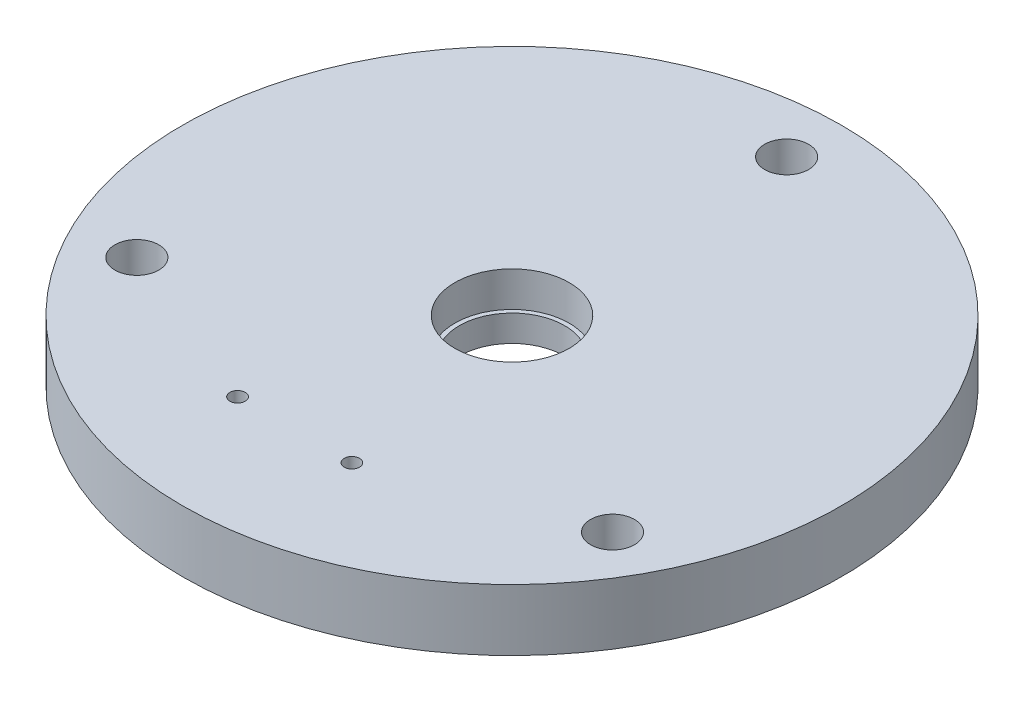
ISO-10303-21;
HEADER;
FILE_DESCRIPTION(('STEP AP214'),'2;1');
FILE_NAME('part.step','',(''),(''),'','','');
FILE_SCHEMA(('AUTOMOTIVE_DESIGN { 1 0 10303 214 1 1 1 1 }'));
ENDSEC;
DATA;
#1=APPLICATION_CONTEXT('core data for automotive mechanical design processes');
#2=APPLICATION_PROTOCOL_DEFINITION('international standard','automotive_design',2000,#1);
#3=PRODUCT_CONTEXT('',#1,'mechanical');
#4=PRODUCT('Part','Part','',(#3));
#5=PRODUCT_RELATED_PRODUCT_CATEGORY('part','',(#4));
#6=PRODUCT_DEFINITION_FORMATION('','',#4);
#7=PRODUCT_DEFINITION_CONTEXT('part definition',#1,'design');
#8=PRODUCT_DEFINITION('design','',#6,#7);
#9=PRODUCT_DEFINITION_SHAPE('','',#8);
#10=(LENGTH_UNIT() NAMED_UNIT(*) SI_UNIT(.MILLI.,.METRE.));
#11=(NAMED_UNIT(*) PLANE_ANGLE_UNIT() SI_UNIT($,.RADIAN.));
#12=(NAMED_UNIT(*) SI_UNIT($,.STERADIAN.) SOLID_ANGLE_UNIT());
#13=UNCERTAINTY_MEASURE_WITH_UNIT(LENGTH_MEASURE(1.E-05),#10,'distance_accuracy_value','');
#14=(GEOMETRIC_REPRESENTATION_CONTEXT(3) GLOBAL_UNCERTAINTY_ASSIGNED_CONTEXT((#13)) GLOBAL_UNIT_ASSIGNED_CONTEXT((#10,
#11,#12)) REPRESENTATION_CONTEXT('',''));
#15=CARTESIAN_POINT('',(0.,0.,0.));
#16=DIRECTION('',(0.,0.,1.));
#17=DIRECTION('',(1.,0.,0.));
#18=AXIS2_PLACEMENT_3D('',#15,#16,#17);
#19=CARTESIAN_POINT('',(0.,14.,0.));
#20=DIRECTION('',(0.,-1.,0.));
#21=DIRECTION('',(0.,0.,-1.));
#22=AXIS2_PLACEMENT_3D('',#19,#20,#21);
#23=CYLINDRICAL_SURFACE('',#22,75.);
#24=CARTESIAN_POINT('',(0.,14.,0.));
#25=DIRECTION('',(0.,1.,0.));
#26=DIRECTION('',(0.,0.,1.));
#27=AXIS2_PLACEMENT_3D('',#24,#25,#26);
#28=CIRCLE('',#27,75.);
#29=CARTESIAN_POINT('',(0.,14.,75.));
#30=VERTEX_POINT('',#29);
#31=EDGE_CURVE('E10',#30,#30,#28,.T.);
#32=ORIENTED_EDGE('',*,*,#31,.F.);
#33=EDGE_LOOP('',(#32));
#34=FACE_BOUND('',#33,.T.);
#35=CARTESIAN_POINT('',(0.,0.,0.));
#36=DIRECTION('',(0.,1.,0.));
#37=DIRECTION('',(0.,0.,1.));
#38=AXIS2_PLACEMENT_3D('',#35,#36,#37);
#39=CIRCLE('',#38,75.);
#40=CARTESIAN_POINT('',(0.,0.,75.));
#41=VERTEX_POINT('',#40);
#42=EDGE_CURVE('E38',#41,#41,#39,.T.);
#43=ORIENTED_EDGE('',*,*,#42,.T.);
#44=EDGE_LOOP('',(#43));
#45=FACE_BOUND('',#44,.T.);
#46=ADVANCED_FACE('F35',(#34,#45),#23,.T.);
#47=CARTESIAN_POINT('',(0.,14.,0.));
#48=DIRECTION('',(0.,1.,0.));
#49=DIRECTION('',(0.,0.,1.));
#50=AXIS2_PLACEMENT_3D('',#47,#48,#49);
#51=PLANE('',#50);
#52=CARTESIAN_POINT('',(10.7983657553551,14.,47.2506615839935));
#53=DIRECTION('',(0.,1.,0.));
#54=DIRECTION('',(0.,0.,1.));
#55=AXIS2_PLACEMENT_3D('',#52,#53,#54);
#56=CIRCLE('',#55,1.75);
#57=CARTESIAN_POINT('',(10.7983657553551,14.,49.0006615839935));
#58=VERTEX_POINT('',#57);
#59=EDGE_CURVE('E83',#58,#58,#56,.T.);
#60=ORIENTED_EDGE('',*,*,#59,.F.);
#61=EDGE_LOOP('',(#60));
#62=FACE_BOUND('',#61,.T.);
#63=CARTESIAN_POINT('',(-15.201634244645,14.,47.2506615839935));
#64=DIRECTION('',(0.,1.,0.));
#65=DIRECTION('',(0.,0.,1.));
#66=AXIS2_PLACEMENT_3D('',#63,#64,#65);
#67=CIRCLE('',#66,1.75);
#68=CARTESIAN_POINT('',(-15.201634244645,14.,49.0006615839935));
#69=VERTEX_POINT('',#68);
#70=EDGE_CURVE('E77',#69,#69,#67,.T.);
#71=ORIENTED_EDGE('',*,*,#70,.F.);
#72=EDGE_LOOP('',(#71));
#73=FACE_BOUND('',#72,.T.);
#74=CARTESIAN_POINT('',(-54.1265877365273,14.,31.2500000000003));
#75=DIRECTION('',(0.,1.,0.));
#76=DIRECTION('',(0.,0.,1.));
#77=AXIS2_PLACEMENT_3D('',#74,#75,#76);
#78=CIRCLE('',#77,4.99999999999999);
#79=CARTESIAN_POINT('',(-54.1265877365273,14.,36.2500000000003));
#80=VERTEX_POINT('',#79);
#81=EDGE_CURVE('E71',#80,#80,#78,.T.);
#82=ORIENTED_EDGE('',*,*,#81,.F.);
#83=EDGE_LOOP('',(#82));
#84=FACE_BOUND('',#83,.T.);
#85=CARTESIAN_POINT('',(54.1265877365273,14.,31.2500000000003));
#86=DIRECTION('',(0.,1.,0.));
#87=DIRECTION('',(0.,0.,1.));
#88=AXIS2_PLACEMENT_3D('',#85,#86,#87);
#89=CIRCLE('',#88,5.);
#90=CARTESIAN_POINT('',(54.1265877365273,14.,36.2500000000003));
#91=VERTEX_POINT('',#90);
#92=EDGE_CURVE('E65',#91,#91,#89,.T.);
#93=ORIENTED_EDGE('',*,*,#92,.F.);
#94=EDGE_LOOP('',(#93));
#95=FACE_BOUND('',#94,.T.);
#96=CARTESIAN_POINT('',(0.,14.,-62.5));
#97=DIRECTION('',(0.,1.,0.));
#98=DIRECTION('',(0.,0.,1.));
#99=AXIS2_PLACEMENT_3D('',#96,#97,#98);
#100=CIRCLE('',#99,5.);
#101=CARTESIAN_POINT('',(0.,14.,-57.5));
#102=VERTEX_POINT('',#101);
#103=EDGE_CURVE('E59',#102,#102,#100,.T.);
#104=ORIENTED_EDGE('',*,*,#103,.F.);
#105=EDGE_LOOP('',(#104));
#106=FACE_BOUND('',#105,.T.);
#107=CARTESIAN_POINT('',(0.,14.,0.));
#108=DIRECTION('',(0.,1.,0.));
#109=DIRECTION('',(0.,0.,1.));
#110=AXIS2_PLACEMENT_3D('',#107,#108,#109);
#111=CIRCLE('',#110,13.);
#112=CARTESIAN_POINT('',(0.,14.,13.));
#113=VERTEX_POINT('',#112);
#114=EDGE_CURVE('E47',#113,#113,#111,.T.);
#115=ORIENTED_EDGE('',*,*,#114,.F.);
#116=EDGE_LOOP('',(#115));
#117=FACE_BOUND('',#116,.T.);
#118=ORIENTED_EDGE('',*,*,#31,.T.);
#119=EDGE_LOOP('',(#118));
#120=FACE_BOUND('',#119,.T.);
#121=ADVANCED_FACE('F99',(#62,#73,#84,#95,#106,#117,#120),#51,.T.);
#122=CARTESIAN_POINT('',(0.,0.,0.));
#123=DIRECTION('',(0.,1.,0.));
#124=DIRECTION('',(0.,0.,1.));
#125=AXIS2_PLACEMENT_3D('',#122,#123,#124);
#126=PLANE('',#125);
#127=CARTESIAN_POINT('',(10.7983657553551,0.,47.2506615839935));
#128=DIRECTION('',(0.,1.,0.));
#129=DIRECTION('',(0.,0.,1.));
#130=AXIS2_PLACEMENT_3D('',#127,#128,#129);
#131=CIRCLE('',#130,1.75);
#132=CARTESIAN_POINT('',(10.7983657553551,0.,49.0006615839935));
#133=VERTEX_POINT('',#132);
#134=EDGE_CURVE('E80',#133,#133,#131,.T.);
#135=ORIENTED_EDGE('',*,*,#134,.T.);
#136=EDGE_LOOP('',(#135));
#137=FACE_BOUND('',#136,.T.);
#138=CARTESIAN_POINT('',(-15.201634244645,0.,47.2506615839935));
#139=DIRECTION('',(0.,1.,0.));
#140=DIRECTION('',(0.,0.,1.));
#141=AXIS2_PLACEMENT_3D('',#138,#139,#140);
#142=CIRCLE('',#141,1.75);
#143=CARTESIAN_POINT('',(-15.201634244645,0.,49.0006615839935));
#144=VERTEX_POINT('',#143);
#145=EDGE_CURVE('E74',#144,#144,#142,.T.);
#146=ORIENTED_EDGE('',*,*,#145,.T.);
#147=EDGE_LOOP('',(#146));
#148=FACE_BOUND('',#147,.T.);
#149=CARTESIAN_POINT('',(-54.1265877365273,0.,31.2500000000003));
#150=DIRECTION('',(0.,1.,0.));
#151=DIRECTION('',(0.,0.,1.));
#152=AXIS2_PLACEMENT_3D('',#149,#150,#151);
#153=CIRCLE('',#152,4.99999999999999);
#154=CARTESIAN_POINT('',(-54.1265877365273,0.,36.2500000000003));
#155=VERTEX_POINT('',#154);
#156=EDGE_CURVE('E68',#155,#155,#153,.T.);
#157=ORIENTED_EDGE('',*,*,#156,.T.);
#158=EDGE_LOOP('',(#157));
#159=FACE_BOUND('',#158,.T.);
#160=CARTESIAN_POINT('',(54.1265877365273,0.,31.2500000000003));
#161=DIRECTION('',(0.,1.,0.));
#162=DIRECTION('',(0.,0.,1.));
#163=AXIS2_PLACEMENT_3D('',#160,#161,#162);
#164=CIRCLE('',#163,5.);
#165=CARTESIAN_POINT('',(54.1265877365273,0.,36.2500000000003));
#166=VERTEX_POINT('',#165);
#167=EDGE_CURVE('E62',#166,#166,#164,.T.);
#168=ORIENTED_EDGE('',*,*,#167,.T.);
#169=EDGE_LOOP('',(#168));
#170=FACE_BOUND('',#169,.T.);
#171=CARTESIAN_POINT('',(0.,0.,-62.5));
#172=DIRECTION('',(0.,1.,0.));
#173=DIRECTION('',(0.,0.,1.));
#174=AXIS2_PLACEMENT_3D('',#171,#172,#173);
#175=CIRCLE('',#174,5.);
#176=CARTESIAN_POINT('',(0.,0.,-57.5));
#177=VERTEX_POINT('',#176);
#178=EDGE_CURVE('E58',#177,#177,#175,.T.);
#179=ORIENTED_EDGE('',*,*,#178,.T.);
#180=EDGE_LOOP('',(#179));
#181=FACE_BOUND('',#180,.T.);
#182=CARTESIAN_POINT('',(0.,0.,0.));
#183=DIRECTION('',(0.,1.,0.));
#184=DIRECTION('',(0.,0.,1.));
#185=AXIS2_PLACEMENT_3D('',#182,#183,#184);
#186=CIRCLE('',#185,12.);
#187=CARTESIAN_POINT('',(0.,0.,12.));
#188=VERTEX_POINT('',#187);
#189=EDGE_CURVE('E50',#188,#188,#186,.T.);
#190=ORIENTED_EDGE('',*,*,#189,.T.);
#191=EDGE_LOOP('',(#190));
#192=FACE_BOUND('',#191,.T.);
#193=ORIENTED_EDGE('',*,*,#42,.F.);
#194=EDGE_LOOP('',(#193));
#195=FACE_BOUND('',#194,.T.);
#196=ADVANCED_FACE('F89',(#137,#148,#159,#170,#181,#192,#195),#126,.F.);
#197=CARTESIAN_POINT('',(0.,6.,0.));
#198=DIRECTION('',(0.,1.,0.));
#199=DIRECTION('',(0.,0.,1.));
#200=AXIS2_PLACEMENT_3D('',#197,#198,#199);
#201=CYLINDRICAL_SURFACE('',#200,13.);
#202=CARTESIAN_POINT('',(0.,6.,0.));
#203=DIRECTION('',(0.,1.,0.));
#204=DIRECTION('',(0.,0.,1.));
#205=AXIS2_PLACEMENT_3D('',#202,#203,#204);
#206=CIRCLE('',#205,13.);
#207=CARTESIAN_POINT('',(0.,6.,13.));
#208=VERTEX_POINT('',#207);
#209=EDGE_CURVE('E45',#208,#208,#206,.T.);
#210=ORIENTED_EDGE('',*,*,#209,.F.);
#211=EDGE_LOOP('',(#210));
#212=FACE_BOUND('',#211,.T.);
#213=ORIENTED_EDGE('',*,*,#114,.T.);
#214=EDGE_LOOP('',(#213));
#215=FACE_BOUND('',#214,.T.);
#216=ADVANCED_FACE('F113',(#212,#215),#201,.F.);
#217=CARTESIAN_POINT('',(0.,6.,0.));
#218=DIRECTION('',(0.,1.,0.));
#219=DIRECTION('',(0.,0.,1.));
#220=AXIS2_PLACEMENT_3D('',#217,#218,#219);
#221=PLANE('',#220);
#222=CARTESIAN_POINT('',(0.,6.,0.));
#223=DIRECTION('',(0.,1.,0.));
#224=DIRECTION('',(0.,0.,1.));
#225=AXIS2_PLACEMENT_3D('',#222,#223,#224);
#226=CIRCLE('',#225,12.);
#227=CARTESIAN_POINT('',(0.,6.,12.));
#228=VERTEX_POINT('',#227);
#229=EDGE_CURVE('E55',#228,#228,#226,.T.);
#230=ORIENTED_EDGE('',*,*,#229,.F.);
#231=EDGE_LOOP('',(#230));
#232=FACE_BOUND('',#231,.T.);
#233=ORIENTED_EDGE('',*,*,#209,.T.);
#234=EDGE_LOOP('',(#233));
#235=FACE_BOUND('',#234,.T.);
#236=ADVANCED_FACE('F115',(#232,#235),#221,.T.);
#237=CARTESIAN_POINT('',(0.,-2.,0.));
#238=DIRECTION('',(0.,1.,0.));
#239=DIRECTION('',(0.,0.,1.));
#240=AXIS2_PLACEMENT_3D('',#237,#238,#239);
#241=CYLINDRICAL_SURFACE('',#240,12.);
#242=ORIENTED_EDGE('',*,*,#229,.T.);
#243=EDGE_LOOP('',(#242));
#244=FACE_BOUND('',#243,.T.);
#245=ORIENTED_EDGE('',*,*,#189,.F.);
#246=EDGE_LOOP('',(#245));
#247=FACE_BOUND('',#246,.T.);
#248=ADVANCED_FACE('F122',(#244,#247),#241,.F.);
#249=CARTESIAN_POINT('',(0.,0.,-62.5));
#250=DIRECTION('',(0.,1.,0.));
#251=DIRECTION('',(0.,0.,1.));
#252=AXIS2_PLACEMENT_3D('',#249,#250,#251);
#253=CYLINDRICAL_SURFACE('',#252,5.);
#254=ORIENTED_EDGE('',*,*,#178,.F.);
#255=EDGE_LOOP('',(#254));
#256=FACE_BOUND('',#255,.T.);
#257=ORIENTED_EDGE('',*,*,#103,.T.);
#258=EDGE_LOOP('',(#257));
#259=FACE_BOUND('',#258,.T.);
#260=ADVANCED_FACE('F187',(#256,#259),#253,.F.);
#261=CARTESIAN_POINT('',(54.1265877365273,0.,31.2500000000003));
#262=DIRECTION('',(0.,1.,0.));
#263=DIRECTION('',(0.,0.,1.));
#264=AXIS2_PLACEMENT_3D('',#261,#262,#263);
#265=CYLINDRICAL_SURFACE('',#264,5.);
#266=ORIENTED_EDGE('',*,*,#167,.F.);
#267=EDGE_LOOP('',(#266));
#268=FACE_BOUND('',#267,.T.);
#269=ORIENTED_EDGE('',*,*,#92,.T.);
#270=EDGE_LOOP('',(#269));
#271=FACE_BOUND('',#270,.T.);
#272=ADVANCED_FACE('F178',(#268,#271),#265,.F.);
#273=CARTESIAN_POINT('',(-54.1265877365273,0.,31.2500000000003));
#274=DIRECTION('',(0.,1.,0.));
#275=DIRECTION('',(0.,0.,1.));
#276=AXIS2_PLACEMENT_3D('',#273,#274,#275);
#277=CYLINDRICAL_SURFACE('',#276,4.99999999999999);
#278=ORIENTED_EDGE('',*,*,#156,.F.);
#279=EDGE_LOOP('',(#278));
#280=FACE_BOUND('',#279,.T.);
#281=ORIENTED_EDGE('',*,*,#81,.T.);
#282=EDGE_LOOP('',(#281));
#283=FACE_BOUND('',#282,.T.);
#284=ADVANCED_FACE('F155',(#280,#283),#277,.F.);
#285=CARTESIAN_POINT('',(-15.201634244645,0.,47.2506615839935));
#286=DIRECTION('',(0.,1.,0.));
#287=DIRECTION('',(0.,0.,1.));
#288=AXIS2_PLACEMENT_3D('',#285,#286,#287);
#289=CYLINDRICAL_SURFACE('',#288,1.75);
#290=ORIENTED_EDGE('',*,*,#145,.F.);
#291=EDGE_LOOP('',(#290));
#292=FACE_BOUND('',#291,.T.);
#293=ORIENTED_EDGE('',*,*,#70,.T.);
#294=EDGE_LOOP('',(#293));
#295=FACE_BOUND('',#294,.T.);
#296=ADVANCED_FACE('F95',(#292,#295),#289,.F.);
#297=CARTESIAN_POINT('',(10.7983657553551,0.,47.2506615839935));
#298=DIRECTION('',(0.,1.,0.));
#299=DIRECTION('',(0.,0.,1.));
#300=AXIS2_PLACEMENT_3D('',#297,#298,#299);
#301=CYLINDRICAL_SURFACE('',#300,1.75);
#302=ORIENTED_EDGE('',*,*,#134,.F.);
#303=EDGE_LOOP('',(#302));
#304=FACE_BOUND('',#303,.T.);
#305=ORIENTED_EDGE('',*,*,#59,.T.);
#306=EDGE_LOOP('',(#305));
#307=FACE_BOUND('',#306,.T.);
#308=ADVANCED_FACE('F92',(#304,#307),#301,.F.);
#309=CLOSED_SHELL('',(#46,#121,#196,#216,#236,#248,#260,#272,#284,#296,#308));
#310=MANIFOLD_SOLID_BREP('B2',#309);
#311=ADVANCED_BREP_SHAPE_REPRESENTATION('',(#18,#310),#14);
#312=SHAPE_DEFINITION_REPRESENTATION(#9,#311);
ENDSEC;
END-ISO-10303-21;
